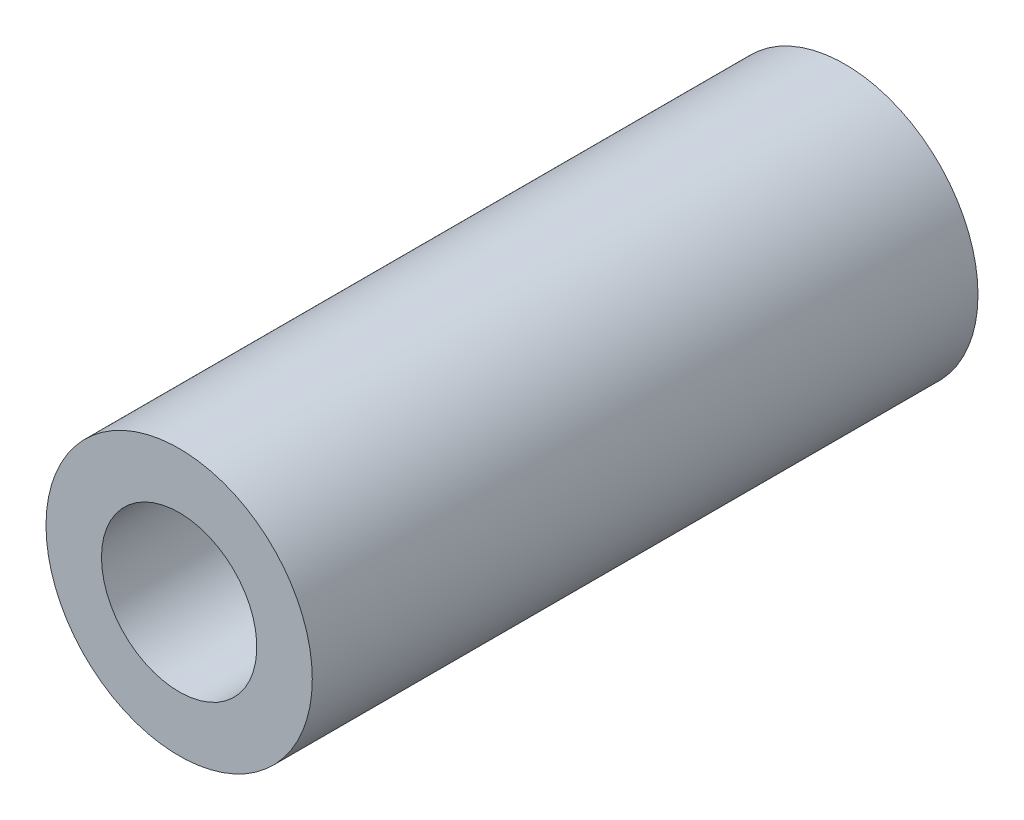
ISO-10303-21;
HEADER;
FILE_DESCRIPTION(('STEP AP214'),'2;1');
FILE_NAME('part.step','',(''),(''),'','','');
FILE_SCHEMA(('AUTOMOTIVE_DESIGN { 1 0 10303 214 1 1 1 1 }'));
ENDSEC;
DATA;
#1=APPLICATION_CONTEXT('core data for automotive mechanical design processes');
#2=APPLICATION_PROTOCOL_DEFINITION('international standard','automotive_design',2000,#1);
#3=PRODUCT_CONTEXT('',#1,'mechanical');
#4=PRODUCT('Part','Part','',(#3));
#5=PRODUCT_RELATED_PRODUCT_CATEGORY('part','',(#4));
#6=PRODUCT_DEFINITION_FORMATION('','',#4);
#7=PRODUCT_DEFINITION_CONTEXT('part definition',#1,'design');
#8=PRODUCT_DEFINITION('design','',#6,#7);
#9=PRODUCT_DEFINITION_SHAPE('','',#8);
#10=(LENGTH_UNIT() NAMED_UNIT(*) SI_UNIT(.MILLI.,.METRE.));
#11=(NAMED_UNIT(*) PLANE_ANGLE_UNIT() SI_UNIT($,.RADIAN.));
#12=(NAMED_UNIT(*) SI_UNIT($,.STERADIAN.) SOLID_ANGLE_UNIT());
#13=UNCERTAINTY_MEASURE_WITH_UNIT(LENGTH_MEASURE(1.E-05),#10,'distance_accuracy_value','');
#14=(GEOMETRIC_REPRESENTATION_CONTEXT(3) GLOBAL_UNCERTAINTY_ASSIGNED_CONTEXT((#13)) GLOBAL_UNIT_ASSIGNED_CONTEXT((#10,
#11,#12)) REPRESENTATION_CONTEXT('',''));
#15=CARTESIAN_POINT('',(0.,0.,0.));
#16=DIRECTION('',(0.,0.,1.));
#17=DIRECTION('',(1.,0.,0.));
#18=AXIS2_PLACEMENT_3D('',#15,#16,#17);
#19=CARTESIAN_POINT('',(1.70671404033902,0.806470296454291,0.));
#20=DIRECTION('',(0.,0.,1.));
#21=DIRECTION('',(1.,0.,0.));
#22=AXIS2_PLACEMENT_3D('',#19,#20,#21);
#23=PLANE('',#22);
#24=CARTESIAN_POINT('',(1.70671404033902,0.806470296454291,0.));
#25=DIRECTION('',(0.,0.,-1.));
#26=DIRECTION('',(1.,0.,0.));
#27=AXIS2_PLACEMENT_3D('',#24,#25,#26);
#28=CIRCLE('',#27,1.75);
#29=CARTESIAN_POINT('',(-0.0432859596609847,0.80647029645429,0.));
#30=VERTEX_POINT('',#29);
#31=EDGE_CURVE('E60',#30,#30,#28,.T.);
#32=ORIENTED_EDGE('',*,*,#31,.F.);
#33=EDGE_LOOP('',(#32));
#34=FACE_BOUND('',#33,.T.);
#35=CARTESIAN_POINT('',(1.70671404033902,0.806470296454291,0.));
#36=DIRECTION('',(0.,0.,1.));
#37=DIRECTION('',(1.,0.,0.));
#38=AXIS2_PLACEMENT_3D('',#35,#36,#37);
#39=CIRCLE('',#38,3.);
#40=CARTESIAN_POINT('',(-1.29328595966098,0.80647029645429,0.));
#41=VERTEX_POINT('',#40);
#42=EDGE_CURVE('E11',#41,#41,#39,.T.);
#43=ORIENTED_EDGE('',*,*,#42,.F.);
#44=EDGE_LOOP('',(#43));
#45=FACE_BOUND('',#44,.T.);
#46=ADVANCED_FACE('F17',(#34,#45),#23,.F.);
#47=CARTESIAN_POINT('',(1.70671404033902,0.806470296454291,15.));
#48=DIRECTION('',(0.,0.,1.));
#49=DIRECTION('',(1.,0.,0.));
#50=AXIS2_PLACEMENT_3D('',#47,#48,#49);
#51=PLANE('',#50);
#52=CARTESIAN_POINT('',(1.70671404033902,0.806470296454291,15.));
#53=DIRECTION('',(0.,0.,-1.));
#54=DIRECTION('',(1.,0.,0.));
#55=AXIS2_PLACEMENT_3D('',#52,#53,#54);
#56=CIRCLE('',#55,1.75);
#57=CARTESIAN_POINT('',(-0.0432859596609847,0.80647029645429,15.));
#58=VERTEX_POINT('',#57);
#59=EDGE_CURVE('E58',#58,#58,#56,.T.);
#60=ORIENTED_EDGE('',*,*,#59,.T.);
#61=EDGE_LOOP('',(#60));
#62=FACE_BOUND('',#61,.T.);
#63=CARTESIAN_POINT('',(1.70671404033902,0.806470296454291,15.));
#64=DIRECTION('',(0.,0.,1.));
#65=DIRECTION('',(1.,0.,0.));
#66=AXIS2_PLACEMENT_3D('',#63,#64,#65);
#67=CIRCLE('',#66,3.);
#68=CARTESIAN_POINT('',(-1.29328595966098,0.80647029645429,15.));
#69=VERTEX_POINT('',#68);
#70=EDGE_CURVE('E21',#69,#69,#67,.T.);
#71=ORIENTED_EDGE('',*,*,#70,.T.);
#72=EDGE_LOOP('',(#71));
#73=FACE_BOUND('',#72,.T.);
#74=ADVANCED_FACE('F63',(#62,#73),#51,.T.);
#75=CARTESIAN_POINT('',(1.70671404033902,0.806470296454291,0.));
#76=DIRECTION('',(0.,0.,1.));
#77=DIRECTION('',(1.,0.,0.));
#78=AXIS2_PLACEMENT_3D('',#75,#76,#77);
#79=CYLINDRICAL_SURFACE('',#78,3.);
#80=ORIENTED_EDGE('',*,*,#70,.F.);
#81=DIRECTION('',(0.,0.,-1.));
#82=VECTOR('',#81,1.);
#83=CARTESIAN_POINT('',(-1.29328595966098,0.80647029645429,0.));
#84=LINE('',#83,#82);
#85=EDGE_CURVE('E27',#69,#41,#84,.T.);
#86=ORIENTED_EDGE('',*,*,#85,.T.);
#87=ORIENTED_EDGE('',*,*,#42,.T.);
#88=ORIENTED_EDGE('',*,*,#85,.F.);
#89=EDGE_LOOP('',(#80,#86,#87,#88));
#90=FACE_BOUND('',#89,.T.);
#91=ADVANCED_FACE('F19',(#90),#79,.T.);
#92=CARTESIAN_POINT('',(1.70671404033902,0.806470296454291,0.));
#93=DIRECTION('',(0.,0.,1.));
#94=DIRECTION('',(1.,0.,0.));
#95=AXIS2_PLACEMENT_3D('',#92,#93,#94);
#96=CYLINDRICAL_SURFACE('',#95,1.75);
#97=ORIENTED_EDGE('',*,*,#59,.F.);
#98=DIRECTION('',(0.,0.,-1.));
#99=VECTOR('',#98,1.);
#100=CARTESIAN_POINT('',(-0.0432859596609847,0.80647029645429,0.));
#101=LINE('',#100,#99);
#102=EDGE_CURVE('E55',#58,#30,#101,.T.);
#103=ORIENTED_EDGE('',*,*,#102,.T.);
#104=ORIENTED_EDGE('',*,*,#31,.T.);
#105=ORIENTED_EDGE('',*,*,#102,.F.);
#106=EDGE_LOOP('',(#97,#103,#104,#105));
#107=FACE_BOUND('',#106,.T.);
#108=ADVANCED_FACE('F57',(#107),#96,.F.);
#109=CLOSED_SHELL('',(#46,#74,#91,#108));
#110=MANIFOLD_SOLID_BREP('B1',#109);
#111=ADVANCED_BREP_SHAPE_REPRESENTATION('',(#18,#110),#14);
#112=SHAPE_DEFINITION_REPRESENTATION(#9,#111);
ENDSEC;
END-ISO-10303-21;
